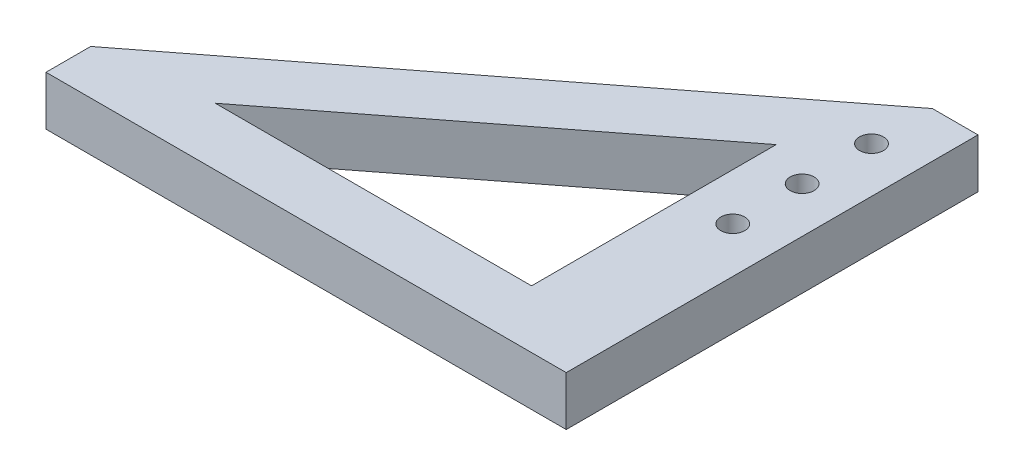
ISO-10303-21;
HEADER;
FILE_DESCRIPTION(('STEP AP214'),'2;1');
FILE_NAME('part.step','',(''),(''),'','','');
FILE_SCHEMA(('AUTOMOTIVE_DESIGN { 1 0 10303 214 1 1 1 1 }'));
ENDSEC;
DATA;
#1=APPLICATION_CONTEXT('core data for automotive mechanical design processes');
#2=APPLICATION_PROTOCOL_DEFINITION('international standard','automotive_design',2000,#1);
#3=PRODUCT_CONTEXT('',#1,'mechanical');
#4=PRODUCT('Part','Part','',(#3));
#5=PRODUCT_RELATED_PRODUCT_CATEGORY('part','',(#4));
#6=PRODUCT_DEFINITION_FORMATION('','',#4);
#7=PRODUCT_DEFINITION_CONTEXT('part definition',#1,'design');
#8=PRODUCT_DEFINITION('design','',#6,#7);
#9=PRODUCT_DEFINITION_SHAPE('','',#8);
#10=(LENGTH_UNIT() NAMED_UNIT(*) SI_UNIT(.MILLI.,.METRE.));
#11=(NAMED_UNIT(*) PLANE_ANGLE_UNIT() SI_UNIT($,.RADIAN.));
#12=(NAMED_UNIT(*) SI_UNIT($,.STERADIAN.) SOLID_ANGLE_UNIT());
#13=UNCERTAINTY_MEASURE_WITH_UNIT(LENGTH_MEASURE(1.E-05),#10,'distance_accuracy_value','');
#14=(GEOMETRIC_REPRESENTATION_CONTEXT(3) GLOBAL_UNCERTAINTY_ASSIGNED_CONTEXT((#13)) GLOBAL_UNIT_ASSIGNED_CONTEXT((#10,
#11,#12)) REPRESENTATION_CONTEXT('',''));
#15=CARTESIAN_POINT('',(0.,0.,0.));
#16=DIRECTION('',(0.,0.,1.));
#17=DIRECTION('',(1.,0.,0.));
#18=AXIS2_PLACEMENT_3D('',#15,#16,#17);
#19=CARTESIAN_POINT('',(19.05,1.6256,-13.5703377589833));
#20=DIRECTION('',(0.,-1.,0.));
#21=DIRECTION('',(0.,0.,-1.));
#22=AXIS2_PLACEMENT_3D('',#19,#20,#21);
#23=PLANE('',#22);
#24=CARTESIAN_POINT('',(17.5478505504094,1.6256,-9.27621674119706));
#25=DIRECTION('',(0.,1.,0.));
#26=DIRECTION('',(0.,0.,1.));
#27=AXIS2_PLACEMENT_3D('',#24,#25,#26);
#28=CIRCLE('',#27,0.393699999999999);
#29=CARTESIAN_POINT('',(17.5478505504094,1.6256,-8.88251674119706));
#30=VERTEX_POINT('',#29);
#31=EDGE_CURVE('E308',#30,#30,#28,.T.);
#32=ORIENTED_EDGE('',*,*,#31,.F.);
#33=EDGE_LOOP('',(#32));
#34=FACE_BOUND('',#33,.T.);
#35=DIRECTION('',(-0.791052984112555,0.,0.611747641047043));
#36=VECTOR('',#35,1.);
#37=CARTESIAN_POINT('',(5.57739124076499,1.6256,-1.905));
#38=LINE('',#37,#36);
#39=CARTESIAN_POINT('',(16.002,1.6256,-9.96669744047508));
#40=VERTEX_POINT('',#39);
#41=CARTESIAN_POINT('',(5.57739124076499,1.6256,-1.905));
#42=VERTEX_POINT('',#41);
#43=EDGE_CURVE('E98',#40,#42,#38,.T.);
#44=ORIENTED_EDGE('',*,*,#43,.F.);
#45=DIRECTION('',(0.,0.,-1.));
#46=VECTOR('',#45,1.);
#47=CARTESIAN_POINT('',(16.002,1.6256,-1.905));
#48=LINE('',#47,#46);
#49=CARTESIAN_POINT('',(16.002,1.6256,-1.905));
#50=VERTEX_POINT('',#49);
#51=EDGE_CURVE('E116',#50,#40,#48,.T.);
#52=ORIENTED_EDGE('',*,*,#51,.F.);
#53=DIRECTION('',(1.,0.,0.));
#54=VECTOR('',#53,1.);
#55=CARTESIAN_POINT('',(5.57739124076499,1.6256,-1.905));
#56=LINE('',#55,#54);
#57=EDGE_CURVE('E106',#42,#50,#56,.T.);
#58=ORIENTED_EDGE('',*,*,#57,.F.);
#59=EDGE_LOOP('',(#44,#52,#58));
#60=FACE_BOUND('',#59,.T.);
#61=DIRECTION('',(0.,0.,-1.));
#62=VECTOR('',#61,1.);
#63=CARTESIAN_POINT('',(19.05,1.6256,0.));
#64=LINE('',#63,#62);
#65=CARTESIAN_POINT('',(19.05,1.6256,0.));
#66=VERTEX_POINT('',#65);
#67=CARTESIAN_POINT('',(19.05,1.6256,-13.5703377589833));
#68=VERTEX_POINT('',#67);
#69=EDGE_CURVE('E128',#66,#68,#64,.T.);
#70=ORIENTED_EDGE('',*,*,#69,.T.);
#71=DIRECTION('',(-1.,0.,0.));
#72=VECTOR('',#71,1.);
#73=CARTESIAN_POINT('',(17.5478505504094,1.6256,-13.5703377589833));
#74=LINE('',#73,#72);
#75=CARTESIAN_POINT('',(17.5478505504094,1.6256,-13.5703377589833));
#76=VERTEX_POINT('',#75);
#77=EDGE_CURVE('E131',#68,#76,#74,.T.);
#78=ORIENTED_EDGE('',*,*,#77,.T.);
#79=DIRECTION('',(-0.791052984112555,0.,0.611747641047043));
#80=VECTOR('',#79,1.);
#81=CARTESIAN_POINT('',(1.905,1.6256,-1.4732));
#82=LINE('',#81,#80);
#83=CARTESIAN_POINT('',(1.905,1.6256,-1.4732));
#84=VERTEX_POINT('',#83);
#85=EDGE_CURVE('E134',#76,#84,#82,.T.);
#86=ORIENTED_EDGE('',*,*,#85,.T.);
#87=DIRECTION('',(0.,0.,1.));
#88=VECTOR('',#87,1.);
#89=CARTESIAN_POINT('',(1.905,1.6256,0.));
#90=LINE('',#89,#88);
#91=CARTESIAN_POINT('',(1.905,1.6256,0.));
#92=VERTEX_POINT('',#91);
#93=EDGE_CURVE('E136',#84,#92,#90,.T.);
#94=ORIENTED_EDGE('',*,*,#93,.T.);
#95=DIRECTION('',(1.,0.,0.));
#96=VECTOR('',#95,1.);
#97=CARTESIAN_POINT('',(1.905,1.6256,0.));
#98=LINE('',#97,#96);
#99=EDGE_CURVE('E138',#92,#66,#98,.T.);
#100=ORIENTED_EDGE('',*,*,#99,.T.);
#101=EDGE_LOOP('',(#70,#78,#86,#94,#100));
#102=FACE_BOUND('',#101,.T.);
#103=CARTESIAN_POINT('',(17.5478505504094,1.6256,-11.5622167411971));
#104=DIRECTION('',(0.,1.,0.));
#105=DIRECTION('',(0.,0.,1.));
#106=AXIS2_PLACEMENT_3D('',#103,#104,#105);
#107=CIRCLE('',#106,0.393699999999999);
#108=CARTESIAN_POINT('',(17.5478505504094,1.6256,-11.1685167411971));
#109=VERTEX_POINT('',#108);
#110=EDGE_CURVE('E122',#109,#109,#107,.T.);
#111=ORIENTED_EDGE('',*,*,#110,.F.);
#112=EDGE_LOOP('',(#111));
#113=FACE_BOUND('',#112,.T.);
#114=CARTESIAN_POINT('',(17.5478505504094,1.6256,-6.99021674119706));
#115=DIRECTION('',(0.,1.,0.));
#116=DIRECTION('',(0.,0.,1.));
#117=AXIS2_PLACEMENT_3D('',#114,#115,#116);
#118=CIRCLE('',#117,0.393699999999999);
#119=CARTESIAN_POINT('',(17.5478505504094,1.6256,-6.59651674119706));
#120=VERTEX_POINT('',#119);
#121=EDGE_CURVE('E299',#120,#120,#118,.T.);
#122=ORIENTED_EDGE('',*,*,#121,.F.);
#123=EDGE_LOOP('',(#122));
#124=FACE_BOUND('',#123,.T.);
#125=ADVANCED_FACE('F33',(#34,#60,#102,#113,#124),#23,.F.);
#126=CARTESIAN_POINT('',(19.05,0.,-13.5703377589833));
#127=DIRECTION('',(0.,-1.,0.));
#128=DIRECTION('',(0.,0.,-1.));
#129=AXIS2_PLACEMENT_3D('',#126,#127,#128);
#130=PLANE('',#129);
#131=CARTESIAN_POINT('',(17.5478505504094,0.,-9.27621674119706));
#132=DIRECTION('',(0.,1.,0.));
#133=DIRECTION('',(0.,0.,1.));
#134=AXIS2_PLACEMENT_3D('',#131,#132,#133);
#135=CIRCLE('',#134,0.393699999999999);
#136=CARTESIAN_POINT('',(17.5478505504094,0.,-8.88251674119706));
#137=VERTEX_POINT('',#136);
#138=EDGE_CURVE('E305',#137,#137,#135,.T.);
#139=ORIENTED_EDGE('',*,*,#138,.T.);
#140=EDGE_LOOP('',(#139));
#141=FACE_BOUND('',#140,.T.);
#142=DIRECTION('',(0.,0.,-1.));
#143=VECTOR('',#142,1.);
#144=CARTESIAN_POINT('',(16.002,0.,-1.905));
#145=LINE('',#144,#143);
#146=CARTESIAN_POINT('',(16.002,0.,-1.905));
#147=VERTEX_POINT('',#146);
#148=CARTESIAN_POINT('',(16.002,0.,-9.96669744047508));
#149=VERTEX_POINT('',#148);
#150=EDGE_CURVE('E107',#147,#149,#145,.T.);
#151=ORIENTED_EDGE('',*,*,#150,.T.);
#152=DIRECTION('',(-0.791052984112555,0.,0.611747641047043));
#153=VECTOR('',#152,1.);
#154=CARTESIAN_POINT('',(5.57739124076499,0.,-1.905));
#155=LINE('',#154,#153);
#156=CARTESIAN_POINT('',(5.57739124076499,0.,-1.905));
#157=VERTEX_POINT('',#156);
#158=EDGE_CURVE('E56',#149,#157,#155,.T.);
#159=ORIENTED_EDGE('',*,*,#158,.T.);
#160=DIRECTION('',(1.,0.,0.));
#161=VECTOR('',#160,1.);
#162=CARTESIAN_POINT('',(5.57739124076499,0.,-1.905));
#163=LINE('',#162,#161);
#164=EDGE_CURVE('E112',#157,#147,#163,.T.);
#165=ORIENTED_EDGE('',*,*,#164,.T.);
#166=EDGE_LOOP('',(#151,#159,#165));
#167=FACE_BOUND('',#166,.T.);
#168=DIRECTION('',(0.,0.,-1.));
#169=VECTOR('',#168,1.);
#170=CARTESIAN_POINT('',(19.05,0.,0.));
#171=LINE('',#170,#169);
#172=CARTESIAN_POINT('',(19.05,0.,0.));
#173=VERTEX_POINT('',#172);
#174=CARTESIAN_POINT('',(19.05,0.,-13.5703377589833));
#175=VERTEX_POINT('',#174);
#176=EDGE_CURVE('E113',#173,#175,#171,.T.);
#177=ORIENTED_EDGE('',*,*,#176,.F.);
#178=DIRECTION('',(1.,0.,0.));
#179=VECTOR('',#178,1.);
#180=CARTESIAN_POINT('',(1.905,0.,0.));
#181=LINE('',#180,#179);
#182=CARTESIAN_POINT('',(1.905,0.,0.));
#183=VERTEX_POINT('',#182);
#184=EDGE_CURVE('E132',#183,#173,#181,.T.);
#185=ORIENTED_EDGE('',*,*,#184,.F.);
#186=DIRECTION('',(0.,0.,1.));
#187=VECTOR('',#186,1.);
#188=CARTESIAN_POINT('',(1.905,0.,0.));
#189=LINE('',#188,#187);
#190=CARTESIAN_POINT('',(1.905,0.,-1.4732));
#191=VERTEX_POINT('',#190);
#192=EDGE_CURVE('E147',#191,#183,#189,.T.);
#193=ORIENTED_EDGE('',*,*,#192,.F.);
#194=DIRECTION('',(-0.791052984112555,0.,0.611747641047043));
#195=VECTOR('',#194,1.);
#196=CARTESIAN_POINT('',(1.905,0.,-1.4732));
#197=LINE('',#196,#195);
#198=CARTESIAN_POINT('',(17.5478505504094,0.,-13.5703377589833));
#199=VERTEX_POINT('',#198);
#200=EDGE_CURVE('E145',#199,#191,#197,.T.);
#201=ORIENTED_EDGE('',*,*,#200,.F.);
#202=DIRECTION('',(-1.,0.,0.));
#203=VECTOR('',#202,1.);
#204=CARTESIAN_POINT('',(17.5478505504094,0.,-13.5703377589833));
#205=LINE('',#204,#203);
#206=EDGE_CURVE('E143',#175,#199,#205,.T.);
#207=ORIENTED_EDGE('',*,*,#206,.F.);
#208=EDGE_LOOP('',(#177,#185,#193,#201,#207));
#209=FACE_BOUND('',#208,.T.);
#210=CARTESIAN_POINT('',(17.5478505504094,0.,-11.5622167411971));
#211=DIRECTION('',(0.,1.,0.));
#212=DIRECTION('',(0.,0.,1.));
#213=AXIS2_PLACEMENT_3D('',#210,#211,#212);
#214=CIRCLE('',#213,0.393699999999999);
#215=CARTESIAN_POINT('',(17.5478505504094,0.,-11.1685167411971));
#216=VERTEX_POINT('',#215);
#217=EDGE_CURVE('E311',#216,#216,#214,.T.);
#218=ORIENTED_EDGE('',*,*,#217,.T.);
#219=EDGE_LOOP('',(#218));
#220=FACE_BOUND('',#219,.T.);
#221=CARTESIAN_POINT('',(17.5478505504094,0.,-6.99021674119706));
#222=DIRECTION('',(0.,1.,0.));
#223=DIRECTION('',(0.,0.,1.));
#224=AXIS2_PLACEMENT_3D('',#221,#222,#223);
#225=CIRCLE('',#224,0.393699999999999);
#226=CARTESIAN_POINT('',(17.5478505504094,0.,-6.59651674119706));
#227=VERTEX_POINT('',#226);
#228=EDGE_CURVE('E302',#227,#227,#225,.T.);
#229=ORIENTED_EDGE('',*,*,#228,.T.);
#230=EDGE_LOOP('',(#229));
#231=FACE_BOUND('',#230,.T.);
#232=ADVANCED_FACE('F168',(#141,#167,#209,#220,#231),#130,.T.);
#233=CARTESIAN_POINT('',(19.05,1.6256,0.));
#234=DIRECTION('',(-1.,0.,0.));
#235=DIRECTION('',(0.,0.,1.));
#236=AXIS2_PLACEMENT_3D('',#233,#234,#235);
#237=PLANE('',#236);
#238=ORIENTED_EDGE('',*,*,#176,.T.);
#239=DIRECTION('',(0.,-1.,0.));
#240=VECTOR('',#239,1.);
#241=CARTESIAN_POINT('',(19.05,1.6256,-13.5703377589833));
#242=LINE('',#241,#240);
#243=EDGE_CURVE('E11',#68,#175,#242,.T.);
#244=ORIENTED_EDGE('',*,*,#243,.F.);
#245=ORIENTED_EDGE('',*,*,#69,.F.);
#246=DIRECTION('',(0.,-1.,0.));
#247=VECTOR('',#246,1.);
#248=CARTESIAN_POINT('',(19.05,1.6256,0.));
#249=LINE('',#248,#247);
#250=EDGE_CURVE('E140',#66,#173,#249,.T.);
#251=ORIENTED_EDGE('',*,*,#250,.T.);
#252=EDGE_LOOP('',(#238,#244,#245,#251));
#253=FACE_BOUND('',#252,.T.);
#254=ADVANCED_FACE('F35',(#253),#237,.F.);
#255=CARTESIAN_POINT('',(17.5478505504094,1.6256,-13.5703377589833));
#256=DIRECTION('',(0.,0.,1.));
#257=DIRECTION('',(1.,0.,0.));
#258=AXIS2_PLACEMENT_3D('',#255,#256,#257);
#259=PLANE('',#258);
#260=ORIENTED_EDGE('',*,*,#206,.T.);
#261=DIRECTION('',(0.,-1.,0.));
#262=VECTOR('',#261,1.);
#263=CARTESIAN_POINT('',(17.5478505504094,1.6256,-13.5703377589833));
#264=LINE('',#263,#262);
#265=EDGE_CURVE('E41',#76,#199,#264,.T.);
#266=ORIENTED_EDGE('',*,*,#265,.F.);
#267=ORIENTED_EDGE('',*,*,#77,.F.);
#268=ORIENTED_EDGE('',*,*,#243,.T.);
#269=EDGE_LOOP('',(#260,#266,#267,#268));
#270=FACE_BOUND('',#269,.T.);
#271=ADVANCED_FACE('F182',(#270),#259,.F.);
#272=CARTESIAN_POINT('',(1.905,1.6256,-1.4732));
#273=DIRECTION('',(0.611747641047043,0.,0.791052984112555));
#274=DIRECTION('',(0.791052984112555,0.,-0.611747641047043));
#275=AXIS2_PLACEMENT_3D('',#272,#273,#274);
#276=PLANE('',#275);
#277=ORIENTED_EDGE('',*,*,#200,.T.);
#278=DIRECTION('',(0.,-1.,0.));
#279=VECTOR('',#278,1.);
#280=CARTESIAN_POINT('',(1.905,1.6256,-1.4732));
#281=LINE('',#280,#279);
#282=EDGE_CURVE('E155',#84,#191,#281,.T.);
#283=ORIENTED_EDGE('',*,*,#282,.F.);
#284=ORIENTED_EDGE('',*,*,#85,.F.);
#285=ORIENTED_EDGE('',*,*,#265,.T.);
#286=EDGE_LOOP('',(#277,#283,#284,#285));
#287=FACE_BOUND('',#286,.T.);
#288=ADVANCED_FACE('F162',(#287),#276,.F.);
#289=CARTESIAN_POINT('',(1.905,1.6256,0.));
#290=DIRECTION('',(1.,0.,0.));
#291=DIRECTION('',(0.,0.,-1.));
#292=AXIS2_PLACEMENT_3D('',#289,#290,#291);
#293=PLANE('',#292);
#294=ORIENTED_EDGE('',*,*,#192,.T.);
#295=DIRECTION('',(0.,-1.,0.));
#296=VECTOR('',#295,1.);
#297=CARTESIAN_POINT('',(1.905,1.6256,0.));
#298=LINE('',#297,#296);
#299=EDGE_CURVE('E152',#92,#183,#298,.T.);
#300=ORIENTED_EDGE('',*,*,#299,.F.);
#301=ORIENTED_EDGE('',*,*,#93,.F.);
#302=ORIENTED_EDGE('',*,*,#282,.T.);
#303=EDGE_LOOP('',(#294,#300,#301,#302));
#304=FACE_BOUND('',#303,.T.);
#305=ADVANCED_FACE('F173',(#304),#293,.F.);
#306=CARTESIAN_POINT('',(1.905,1.6256,0.));
#307=DIRECTION('',(0.,0.,-1.));
#308=DIRECTION('',(-1.,0.,0.));
#309=AXIS2_PLACEMENT_3D('',#306,#307,#308);
#310=PLANE('',#309);
#311=ORIENTED_EDGE('',*,*,#184,.T.);
#312=ORIENTED_EDGE('',*,*,#250,.F.);
#313=ORIENTED_EDGE('',*,*,#99,.F.);
#314=ORIENTED_EDGE('',*,*,#299,.T.);
#315=EDGE_LOOP('',(#311,#312,#313,#314));
#316=FACE_BOUND('',#315,.T.);
#317=ADVANCED_FACE('F177',(#316),#310,.F.);
#318=CARTESIAN_POINT('',(5.57739124076499,1.6256,-1.905));
#319=DIRECTION('',(0.611747641047043,0.,0.791052984112555));
#320=DIRECTION('',(0.791052984112555,0.,-0.611747641047043));
#321=AXIS2_PLACEMENT_3D('',#318,#319,#320);
#322=PLANE('',#321);
#323=ORIENTED_EDGE('',*,*,#158,.F.);
#324=DIRECTION('',(0.,-1.,0.));
#325=VECTOR('',#324,1.);
#326=CARTESIAN_POINT('',(16.002,1.6256,-9.96669744047508));
#327=LINE('',#326,#325);
#328=EDGE_CURVE('E102',#40,#149,#327,.T.);
#329=ORIENTED_EDGE('',*,*,#328,.F.);
#330=ORIENTED_EDGE('',*,*,#43,.T.);
#331=DIRECTION('',(0.,-1.,0.));
#332=VECTOR('',#331,1.);
#333=CARTESIAN_POINT('',(5.57739124076499,1.6256,-1.905));
#334=LINE('',#333,#332);
#335=EDGE_CURVE('E101',#42,#157,#334,.T.);
#336=ORIENTED_EDGE('',*,*,#335,.T.);
#337=EDGE_LOOP('',(#323,#329,#330,#336));
#338=FACE_BOUND('',#337,.T.);
#339=ADVANCED_FACE('F100',(#338),#322,.T.);
#340=CARTESIAN_POINT('',(5.57739124076499,1.6256,-1.905));
#341=DIRECTION('',(0.,0.,-1.));
#342=DIRECTION('',(-1.,0.,0.));
#343=AXIS2_PLACEMENT_3D('',#340,#341,#342);
#344=PLANE('',#343);
#345=ORIENTED_EDGE('',*,*,#164,.F.);
#346=ORIENTED_EDGE('',*,*,#335,.F.);
#347=ORIENTED_EDGE('',*,*,#57,.T.);
#348=DIRECTION('',(0.,-1.,0.));
#349=VECTOR('',#348,1.);
#350=CARTESIAN_POINT('',(16.002,1.6256,-1.905));
#351=LINE('',#350,#349);
#352=EDGE_CURVE('E48',#50,#147,#351,.T.);
#353=ORIENTED_EDGE('',*,*,#352,.T.);
#354=EDGE_LOOP('',(#345,#346,#347,#353));
#355=FACE_BOUND('',#354,.T.);
#356=ADVANCED_FACE('F110',(#355),#344,.T.);
#357=CARTESIAN_POINT('',(16.002,1.6256,-1.905));
#358=DIRECTION('',(-1.,0.,0.));
#359=DIRECTION('',(0.,0.,1.));
#360=AXIS2_PLACEMENT_3D('',#357,#358,#359);
#361=PLANE('',#360);
#362=ORIENTED_EDGE('',*,*,#150,.F.);
#363=ORIENTED_EDGE('',*,*,#352,.F.);
#364=ORIENTED_EDGE('',*,*,#51,.T.);
#365=ORIENTED_EDGE('',*,*,#328,.T.);
#366=EDGE_LOOP('',(#362,#363,#364,#365));
#367=FACE_BOUND('',#366,.T.);
#368=ADVANCED_FACE('F228',(#367),#361,.T.);
#369=CARTESIAN_POINT('',(17.5478505504094,1.6256,-11.5622167411971));
#370=DIRECTION('',(0.,-1.,0.));
#371=DIRECTION('',(0.,0.,-1.));
#372=AXIS2_PLACEMENT_3D('',#369,#370,#371);
#373=CYLINDRICAL_SURFACE('',#372,0.393699999999999);
#374=ORIENTED_EDGE('',*,*,#110,.T.);
#375=EDGE_LOOP('',(#374));
#376=FACE_BOUND('',#375,.T.);
#377=ORIENTED_EDGE('',*,*,#217,.F.);
#378=EDGE_LOOP('',(#377));
#379=FACE_BOUND('',#378,.T.);
#380=ADVANCED_FACE('F234',(#376,#379),#373,.F.);
#381=CARTESIAN_POINT('',(17.5478505504094,1.6256,-9.27621674119706));
#382=DIRECTION('',(0.,-1.,0.));
#383=DIRECTION('',(0.,0.,-1.));
#384=AXIS2_PLACEMENT_3D('',#381,#382,#383);
#385=CYLINDRICAL_SURFACE('',#384,0.393699999999999);
#386=ORIENTED_EDGE('',*,*,#31,.T.);
#387=EDGE_LOOP('',(#386));
#388=FACE_BOUND('',#387,.T.);
#389=ORIENTED_EDGE('',*,*,#138,.F.);
#390=EDGE_LOOP('',(#389));
#391=FACE_BOUND('',#390,.T.);
#392=ADVANCED_FACE('F241',(#388,#391),#385,.F.);
#393=CARTESIAN_POINT('',(17.5478505504094,1.6256,-6.99021674119706));
#394=DIRECTION('',(0.,-1.,0.));
#395=DIRECTION('',(0.,0.,-1.));
#396=AXIS2_PLACEMENT_3D('',#393,#394,#395);
#397=CYLINDRICAL_SURFACE('',#396,0.393699999999999);
#398=ORIENTED_EDGE('',*,*,#121,.T.);
#399=EDGE_LOOP('',(#398));
#400=FACE_BOUND('',#399,.T.);
#401=ORIENTED_EDGE('',*,*,#228,.F.);
#402=EDGE_LOOP('',(#401));
#403=FACE_BOUND('',#402,.T.);
#404=ADVANCED_FACE('F249',(#400,#403),#397,.F.);
#405=CLOSED_SHELL('',(#125,#232,#254,#271,#288,#305,#317,#339,#356,#368,#380,#392,#404));
#406=MANIFOLD_SOLID_BREP('B2',#405);
#407=ADVANCED_BREP_SHAPE_REPRESENTATION('',(#18,#406),#14);
#408=SHAPE_DEFINITION_REPRESENTATION(#9,#407);
ENDSEC;
END-ISO-10303-21;
